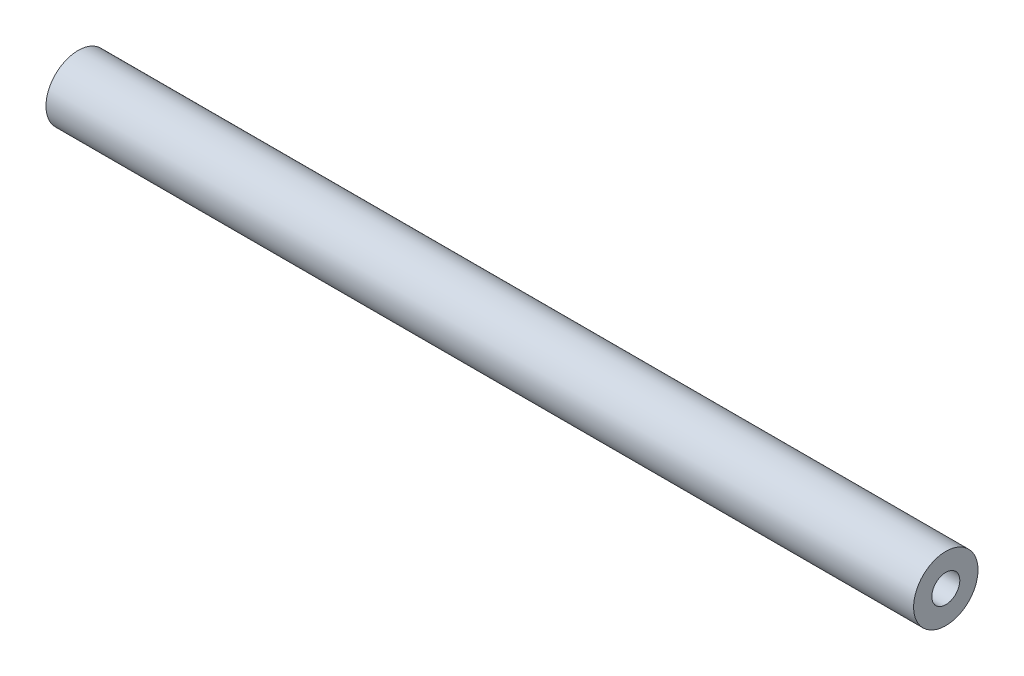
ISO-10303-21;
HEADER;
FILE_DESCRIPTION(('STEP AP214'),'2;1');
FILE_NAME('part.step','',(''),(''),'','','');
FILE_SCHEMA(('AUTOMOTIVE_DESIGN { 1 0 10303 214 1 1 1 1 }'));
ENDSEC;
DATA;
#1=APPLICATION_CONTEXT('core data for automotive mechanical design processes');
#2=APPLICATION_PROTOCOL_DEFINITION('international standard','automotive_design',2000,#1);
#3=PRODUCT_CONTEXT('',#1,'mechanical');
#4=PRODUCT('Part','Part','',(#3));
#5=PRODUCT_RELATED_PRODUCT_CATEGORY('part','',(#4));
#6=PRODUCT_DEFINITION_FORMATION('','',#4);
#7=PRODUCT_DEFINITION_CONTEXT('part definition',#1,'design');
#8=PRODUCT_DEFINITION('design','',#6,#7);
#9=PRODUCT_DEFINITION_SHAPE('','',#8);
#10=(LENGTH_UNIT() NAMED_UNIT(*) SI_UNIT(.MILLI.,.METRE.));
#11=(NAMED_UNIT(*) PLANE_ANGLE_UNIT() SI_UNIT($,.RADIAN.));
#12=(NAMED_UNIT(*) SI_UNIT($,.STERADIAN.) SOLID_ANGLE_UNIT());
#13=UNCERTAINTY_MEASURE_WITH_UNIT(LENGTH_MEASURE(1.E-05),#10,'distance_accuracy_value','');
#14=(GEOMETRIC_REPRESENTATION_CONTEXT(3) GLOBAL_UNCERTAINTY_ASSIGNED_CONTEXT((#13)) GLOBAL_UNIT_ASSIGNED_CONTEXT((#10,
#11,#12)) REPRESENTATION_CONTEXT('',''));
#15=CARTESIAN_POINT('',(0.,0.,0.));
#16=DIRECTION('',(0.,0.,1.));
#17=DIRECTION('',(1.,0.,0.));
#18=AXIS2_PLACEMENT_3D('',#15,#16,#17);
#19=CARTESIAN_POINT('',(310.,0.,0.));
#20=DIRECTION('',(1.,0.,0.));
#21=DIRECTION('',(0.,0.,-1.));
#22=AXIS2_PLACEMENT_3D('',#19,#20,#21);
#23=PLANE('',#22);
#24=CARTESIAN_POINT('',(310.,0.,0.));
#25=DIRECTION('',(1.,0.,0.));
#26=DIRECTION('',(0.,0.,-1.));
#27=AXIS2_PLACEMENT_3D('',#24,#25,#26);
#28=CIRCLE('',#27,11.5);
#29=CARTESIAN_POINT('',(310.,0.,-11.5));
#30=VERTEX_POINT('',#29);
#31=EDGE_CURVE('E10',#30,#30,#28,.T.);
#32=ORIENTED_EDGE('',*,*,#31,.T.);
#33=EDGE_LOOP('',(#32));
#34=FACE_BOUND('',#33,.T.);
#35=CARTESIAN_POINT('',(310.,0.,0.));
#36=DIRECTION('',(1.,0.,0.));
#37=DIRECTION('',(0.,0.,-1.));
#38=AXIS2_PLACEMENT_3D('',#35,#36,#37);
#39=CIRCLE('',#38,5.);
#40=CARTESIAN_POINT('',(310.,0.,-5.));
#41=VERTEX_POINT('',#40);
#42=EDGE_CURVE('E42',#41,#41,#39,.T.);
#43=ORIENTED_EDGE('',*,*,#42,.F.);
#44=EDGE_LOOP('',(#43));
#45=FACE_BOUND('',#44,.T.);
#46=ADVANCED_FACE('F31',(#34,#45),#23,.T.);
#47=CARTESIAN_POINT('',(0.,0.,0.));
#48=DIRECTION('',(1.,0.,0.));
#49=DIRECTION('',(0.,0.,-1.));
#50=AXIS2_PLACEMENT_3D('',#47,#48,#49);
#51=PLANE('',#50);
#52=CARTESIAN_POINT('',(0.,0.,0.));
#53=DIRECTION('',(1.,0.,0.));
#54=DIRECTION('',(0.,0.,-1.));
#55=AXIS2_PLACEMENT_3D('',#52,#53,#54);
#56=CIRCLE('',#55,11.5);
#57=CARTESIAN_POINT('',(0.,0.,-11.5));
#58=VERTEX_POINT('',#57);
#59=EDGE_CURVE('E35',#58,#58,#56,.T.);
#60=ORIENTED_EDGE('',*,*,#59,.F.);
#61=EDGE_LOOP('',(#60));
#62=FACE_BOUND('',#61,.T.);
#63=CARTESIAN_POINT('',(0.,0.,0.));
#64=DIRECTION('',(1.,0.,0.));
#65=DIRECTION('',(0.,0.,-1.));
#66=AXIS2_PLACEMENT_3D('',#63,#64,#65);
#67=CIRCLE('',#66,5.);
#68=CARTESIAN_POINT('',(0.,0.,-5.));
#69=VERTEX_POINT('',#68);
#70=EDGE_CURVE('E44',#69,#69,#67,.T.);
#71=ORIENTED_EDGE('',*,*,#70,.T.);
#72=EDGE_LOOP('',(#71));
#73=FACE_BOUND('',#72,.T.);
#74=ADVANCED_FACE('F54',(#62,#73),#51,.F.);
#75=CARTESIAN_POINT('',(310.,0.,0.));
#76=DIRECTION('',(-1.,0.,0.));
#77=DIRECTION('',(0.,0.,1.));
#78=AXIS2_PLACEMENT_3D('',#75,#76,#77);
#79=CYLINDRICAL_SURFACE('',#78,11.5);
#80=ORIENTED_EDGE('',*,*,#31,.F.);
#81=EDGE_LOOP('',(#80));
#82=FACE_BOUND('',#81,.T.);
#83=ORIENTED_EDGE('',*,*,#59,.T.);
#84=EDGE_LOOP('',(#83));
#85=FACE_BOUND('',#84,.T.);
#86=ADVANCED_FACE('F33',(#82,#85),#79,.T.);
#87=CARTESIAN_POINT('',(310.,0.,0.));
#88=DIRECTION('',(-1.,0.,0.));
#89=DIRECTION('',(0.,0.,1.));
#90=AXIS2_PLACEMENT_3D('',#87,#88,#89);
#91=CYLINDRICAL_SURFACE('',#90,5.);
#92=ORIENTED_EDGE('',*,*,#42,.T.);
#93=EDGE_LOOP('',(#92));
#94=FACE_BOUND('',#93,.T.);
#95=ORIENTED_EDGE('',*,*,#70,.F.);
#96=EDGE_LOOP('',(#95));
#97=FACE_BOUND('',#96,.T.);
#98=ADVANCED_FACE('F50',(#94,#97),#91,.F.);
#99=CLOSED_SHELL('',(#46,#74,#86,#98));
#100=MANIFOLD_SOLID_BREP('B2',#99);
#101=ADVANCED_BREP_SHAPE_REPRESENTATION('',(#18,#100),#14);
#102=SHAPE_DEFINITION_REPRESENTATION(#9,#101);
ENDSEC;
END-ISO-10303-21;
